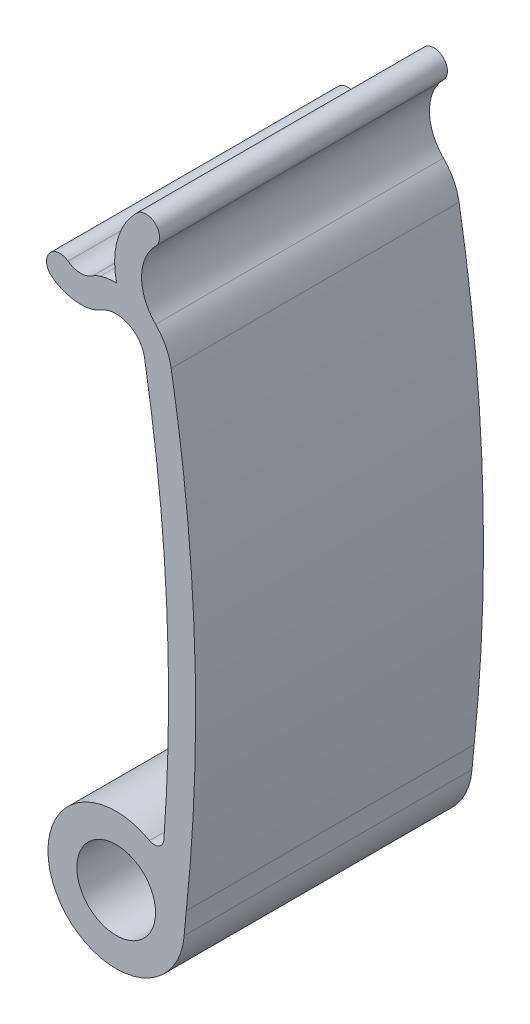
ISO-10303-21;
HEADER;
FILE_DESCRIPTION(('STEP AP214'),'2;1');
FILE_NAME('part.step','',(''),(''),'','','');
FILE_SCHEMA(('AUTOMOTIVE_DESIGN { 1 0 10303 214 1 1 1 1 }'));
ENDSEC;
DATA;
#1=APPLICATION_CONTEXT('core data for automotive mechanical design processes');
#2=APPLICATION_PROTOCOL_DEFINITION('international standard','automotive_design',2000,#1);
#3=PRODUCT_CONTEXT('',#1,'mechanical');
#4=PRODUCT('Part','Part','',(#3));
#5=PRODUCT_RELATED_PRODUCT_CATEGORY('part','',(#4));
#6=PRODUCT_DEFINITION_FORMATION('','',#4);
#7=PRODUCT_DEFINITION_CONTEXT('part definition',#1,'design');
#8=PRODUCT_DEFINITION('design','',#6,#7);
#9=PRODUCT_DEFINITION_SHAPE('','',#8);
#10=(LENGTH_UNIT() NAMED_UNIT(*) SI_UNIT(.MILLI.,.METRE.));
#11=(NAMED_UNIT(*) PLANE_ANGLE_UNIT() SI_UNIT($,.RADIAN.));
#12=(NAMED_UNIT(*) SI_UNIT($,.STERADIAN.) SOLID_ANGLE_UNIT());
#13=UNCERTAINTY_MEASURE_WITH_UNIT(LENGTH_MEASURE(1.E-05),#10,'distance_accuracy_value','');
#14=(GEOMETRIC_REPRESENTATION_CONTEXT(3) GLOBAL_UNCERTAINTY_ASSIGNED_CONTEXT((#13)) GLOBAL_UNIT_ASSIGNED_CONTEXT((#10,
#11,#12)) REPRESENTATION_CONTEXT('',''));
#15=CARTESIAN_POINT('',(0.,0.,0.));
#16=DIRECTION('',(0.,0.,1.));
#17=DIRECTION('',(1.,0.,0.));
#18=AXIS2_PLACEMENT_3D('',#15,#16,#17);
#19=CARTESIAN_POINT('',(3.81837661840536,52.8183766183916,30.));
#20=DIRECTION('',(0.,0.,1.));
#21=DIRECTION('',(1.,0.,0.));
#22=AXIS2_PLACEMENT_3D('',#19,#20,#21);
#23=PLANE('',#22);
#24=CARTESIAN_POINT('',(7.63675323681256,56.6367532368027,30.));
#25=DIRECTION('',(0.,0.,-1.));
#26=DIRECTION('',(1.,0.,0.));
#27=AXIS2_PLACEMENT_3D('',#24,#25,#26);
#28=CIRCLE('',#27,4.98999999999288);
#29=CARTESIAN_POINT('',(4.10829039870005,53.1082903986866,30.));
#30=VERTEX_POINT('',#29);
#31=CARTESIAN_POINT('',(4.10829039870365,60.1652160749285,30.));
#32=VERTEX_POINT('',#31);
#33=EDGE_CURVE('E236',#30,#32,#28,.T.);
#34=ORIENTED_EDGE('',*,*,#33,.T.);
#35=CARTESIAN_POINT('',(3.11480537113575,61.1587011024965,30.));
#36=DIRECTION('',(0.,0.,1.));
#37=DIRECTION('',(1.,0.,0.));
#38=AXIS2_PLACEMENT_3D('',#35,#36,#37);
#39=CIRCLE('',#38,1.40500000000114);
#40=CARTESIAN_POINT('',(2.12132034356786,62.1521861300644,30.));
#41=VERTEX_POINT('',#40);
#42=EDGE_CURVE('E124',#32,#41,#39,.T.);
#43=ORIENTED_EDGE('',*,*,#42,.T.);
#44=CARTESIAN_POINT('',(7.63675323681256,56.6367532368027,30.));
#45=DIRECTION('',(0.,0.,1.));
#46=DIRECTION('',(1.,0.,0.));
#47=AXIS2_PLACEMENT_3D('',#44,#45,#46);
#48=CIRCLE('',#47,7.79999999999547);
#49=CARTESIAN_POINT('',(0.0537416684139435,54.8097514433,30.));
#50=VERTEX_POINT('',#49);
#51=EDGE_CURVE('E289',#41,#50,#48,.T.);
#52=ORIENTED_EDGE('',*,*,#51,.T.);
#53=CARTESIAN_POINT('',(-1.83371113432473E-12,48.9999999999805,30.));
#54=DIRECTION('',(0.,0.,1.));
#55=DIRECTION('',(1.,0.,0.));
#56=AXIS2_PLACEMENT_3D('',#53,#54,#55);
#57=CIRCLE('',#56,5.81000000000713);
#58=CARTESIAN_POINT('',(-1.64437253854609,54.5724446120484,30.));
#59=VERTEX_POINT('',#58);
#60=EDGE_CURVE('E309',#50,#59,#57,.T.);
#61=ORIENTED_EDGE('',*,*,#60,.T.);
#62=CARTESIAN_POINT('',(-0.795298938635227,51.6951066023709,30.));
#63=DIRECTION('',(0.,0.,1.));
#64=DIRECTION('',(-1.,0.,0.));
#65=AXIS2_PLACEMENT_3D('',#62,#63,#64);
#66=CIRCLE('',#65,2.99999999999999);
#67=CARTESIAN_POINT('',(-2.47100072873564,54.1834842888676,30.));
#68=VERTEX_POINT('',#67);
#69=EDGE_CURVE('E305',#59,#68,#66,.T.);
#70=ORIENTED_EDGE('',*,*,#69,.T.);
#71=CARTESIAN_POINT('',(-3.69426303552788,55.9999999999973,30.));
#72=DIRECTION('',(0.,0.,-1.));
#73=DIRECTION('',(1.,0.,0.));
#74=AXIS2_PLACEMENT_3D('',#71,#72,#73);
#75=CIRCLE('',#74,2.19);
#76=CARTESIAN_POINT('',(-5.00826303552788,54.2479999999973,30.));
#77=VERTEX_POINT('',#76);
#78=EDGE_CURVE('E308',#68,#77,#75,.T.);
#79=ORIENTED_EDGE('',*,*,#78,.T.);
#80=CARTESIAN_POINT('',(-5.85126303552771,53.1239999999976,30.));
#81=DIRECTION('',(0.,0.,1.));
#82=DIRECTION('',(1.,0.,0.));
#83=AXIS2_PLACEMENT_3D('',#80,#81,#82);
#84=CIRCLE('',#83,1.40499999999971);
#85=CARTESIAN_POINT('',(-6.69426303552754,51.9999999999978,30.));
#86=VERTEX_POINT('',#85);
#87=EDGE_CURVE('E313',#77,#86,#84,.T.);
#88=ORIENTED_EDGE('',*,*,#87,.T.);
#89=CARTESIAN_POINT('',(-3.69426303552788,55.9999999999973,30.));
#90=DIRECTION('',(0.,0.,1.));
#91=DIRECTION('',(1.,0.,0.));
#92=AXIS2_PLACEMENT_3D('',#89,#90,#91);
#93=CIRCLE('',#92,4.99999999999943);
#94=CARTESIAN_POINT('',(-3.21182535477371,51.023329035971,30.));
#95=VERTEX_POINT('',#94);
#96=EDGE_CURVE('E320',#86,#95,#93,.T.);
#97=ORIENTED_EDGE('',*,*,#96,.T.);
#98=CARTESIAN_POINT('',(-3.59777549934888,55.0046658071953,30.));
#99=DIRECTION('',(0.,0.,1.));
#100=DIRECTION('',(1.,0.,0.));
#101=AXIS2_PLACEMENT_3D('',#98,#99,#100);
#102=CIRCLE('',#101,4.);
#103=CARTESIAN_POINT('',(-1.54190378544653,51.5734282030681,30.));
#104=VERTEX_POINT('',#103);
#105=EDGE_CURVE('E323',#95,#104,#102,.T.);
#106=ORIENTED_EDGE('',*,*,#105,.T.);
#107=CARTESIAN_POINT('',(-1.83371113432473E-12,48.9999999999805,30.));
#108=DIRECTION('',(0.,0.,-1.));
#109=DIRECTION('',(1.,0.,0.));
#110=AXIS2_PLACEMENT_3D('',#107,#108,#109);
#111=CIRCLE('',#110,3.0000000000004);
#112=CARTESIAN_POINT('',(2.9634476844801,49.4668809498393,30.));
#113=VERTEX_POINT('',#112);
#114=EDGE_CURVE('E326',#104,#113,#111,.T.);
#115=ORIENTED_EDGE('',*,*,#114,.T.);
#116=CARTESIAN_POINT('',(-168.827300894525,20.0737468694761,30.));
#117=DIRECTION('',(0.,0.,-1.));
#118=DIRECTION('',(1.,0.,0.));
#119=AXIS2_PLACEMENT_3D('',#116,#117,#118);
#120=CIRCLE('',#119,174.28717000514);
#121=CARTESIAN_POINT('',(4.9685329803078,6.99606526485237,30.));
#122=VERTEX_POINT('',#121);
#123=EDGE_CURVE('E329',#113,#122,#120,.T.);
#124=ORIENTED_EDGE('',*,*,#123,.T.);
#125=CARTESIAN_POINT('',(3.97135209849246,7.07110051618069,30.));
#126=DIRECTION('',(0.,0.,-1.));
#127=DIRECTION('',(1.,0.,0.));
#128=AXIS2_PLACEMENT_3D('',#125,#126,#127);
#129=CIRCLE('',#128,0.999999999998197);
#130=CARTESIAN_POINT('',(3.48166626637826,6.19920156227433,30.));
#131=VERTEX_POINT('',#130);
#132=EDGE_CURVE('E332',#122,#131,#129,.T.);
#133=ORIENTED_EDGE('',*,*,#132,.T.);
#134=CARTESIAN_POINT('',(-1.13619508766705E-11,-2.87762164357525E-12,30.));
#135=DIRECTION('',(0.,0.,1.));
#136=DIRECTION('',(1.,0.,0.));
#137=AXIS2_PLACEMENT_3D('',#134,#135,#136);
#138=CIRCLE('',#137,7.11000000001977);
#139=CARTESIAN_POINT('',(7.08641136872805,-0.578682912556882,30.));
#140=VERTEX_POINT('',#139);
#141=EDGE_CURVE('E167',#131,#140,#138,.T.);
#142=ORIENTED_EDGE('',*,*,#141,.T.);
#143=CARTESIAN_POINT('',(106.754644402773,-8.71768308897163,30.));
#144=DIRECTION('',(0.,0.,-1.));
#145=DIRECTION('',(-1.,0.,0.));
#146=AXIS2_PLACEMENT_3D('',#143,#144,#145);
#147=CIRCLE('',#146,100.000000000004);
#148=CARTESIAN_POINT('',(7.30747963802911,1.78286071859413,30.));
#149=VERTEX_POINT('',#148);
#150=EDGE_CURVE('E161',#140,#149,#147,.T.);
#151=ORIENTED_EDGE('',*,*,#150,.T.);
#152=CARTESIAN_POINT('',(-167.014909156982,20.1894174519368,30.));
#153=DIRECTION('',(0.,0.,1.));
#154=DIRECTION('',(1.,0.,0.));
#155=AXIS2_PLACEMENT_3D('',#152,#153,#154);
#156=CIRCLE('',#155,175.291461760055);
#157=CARTESIAN_POINT('',(5.73332285303255,49.9408023506448,30.));
#158=VERTEX_POINT('',#157);
#159=EDGE_CURVE('E165',#149,#158,#156,.T.);
#160=ORIENTED_EDGE('',*,*,#159,.T.);
#161=CARTESIAN_POINT('',(-1.83371113432473E-12,48.9999999999805,30.));
#162=DIRECTION('',(0.,0.,1.));
#163=DIRECTION('',(1.,0.,0.));
#164=AXIS2_PLACEMENT_3D('',#161,#162,#163);
#165=CIRCLE('',#164,5.81000000001437);
#166=EDGE_CURVE('E57',#158,#30,#165,.T.);
#167=ORIENTED_EDGE('',*,*,#166,.T.);
#168=EDGE_LOOP('',(#34,#43,#52,#61,#70,#79,#88,#97,#106,#115,#124,#133,#142,#151,#160,#167));
#169=FACE_BOUND('',#168,.T.);
#170=CARTESIAN_POINT('',(-1.13619508766705E-11,-2.87762164357525E-12,30.));
#171=DIRECTION('',(0.,0.,1.));
#172=DIRECTION('',(1.,0.,0.));
#173=AXIS2_PLACEMENT_3D('',#170,#171,#172);
#174=CIRCLE('',#173,4.1);
#175=CARTESIAN_POINT('',(4.09999999998864,-2.87762164357525E-12,30.));
#176=VERTEX_POINT('',#175);
#177=EDGE_CURVE('E194',#176,#176,#174,.T.);
#178=ORIENTED_EDGE('',*,*,#177,.F.);
#179=EDGE_LOOP('',(#178));
#180=FACE_BOUND('',#179,.T.);
#181=ADVANCED_FACE('F39',(#169,#180),#23,.T.);
#182=CARTESIAN_POINT('',(3.81837661840536,52.8183766183916,0.));
#183=DIRECTION('',(0.,0.,1.));
#184=DIRECTION('',(1.,0.,0.));
#185=AXIS2_PLACEMENT_3D('',#182,#183,#184);
#186=PLANE('',#185);
#187=CARTESIAN_POINT('',(7.63675323681256,56.6367532368027,0.));
#188=DIRECTION('',(0.,0.,-1.));
#189=DIRECTION('',(1.,0.,0.));
#190=AXIS2_PLACEMENT_3D('',#187,#188,#189);
#191=CIRCLE('',#190,4.98999999999288);
#192=CARTESIAN_POINT('',(4.10829039870005,53.1082903986866,0.));
#193=VERTEX_POINT('',#192);
#194=CARTESIAN_POINT('',(4.10829039870365,60.1652160749285,0.));
#195=VERTEX_POINT('',#194);
#196=EDGE_CURVE('E189',#193,#195,#191,.T.);
#197=ORIENTED_EDGE('',*,*,#196,.F.);
#198=CARTESIAN_POINT('',(-1.83371113432473E-12,48.9999999999805,0.));
#199=DIRECTION('',(0.,0.,1.));
#200=DIRECTION('',(1.,0.,0.));
#201=AXIS2_PLACEMENT_3D('',#198,#199,#200);
#202=CIRCLE('',#201,5.81000000001437);
#203=CARTESIAN_POINT('',(5.73332285303255,49.9408023506448,0.));
#204=VERTEX_POINT('',#203);
#205=EDGE_CURVE('E116',#204,#193,#202,.T.);
#206=ORIENTED_EDGE('',*,*,#205,.F.);
#207=CARTESIAN_POINT('',(-167.014909156982,20.1894174519368,0.));
#208=DIRECTION('',(0.,0.,1.));
#209=DIRECTION('',(1.,0.,0.));
#210=AXIS2_PLACEMENT_3D('',#207,#208,#209);
#211=CIRCLE('',#210,175.291461760055);
#212=CARTESIAN_POINT('',(7.30747963802911,1.78286071859413,0.));
#213=VERTEX_POINT('',#212);
#214=EDGE_CURVE('E110',#213,#204,#211,.T.);
#215=ORIENTED_EDGE('',*,*,#214,.F.);
#216=CARTESIAN_POINT('',(106.754644402773,-8.71768308897163,0.));
#217=DIRECTION('',(0.,0.,-1.));
#218=DIRECTION('',(-1.,0.,0.));
#219=AXIS2_PLACEMENT_3D('',#216,#217,#218);
#220=CIRCLE('',#219,100.000000000004);
#221=CARTESIAN_POINT('',(7.08641136872805,-0.578682912556882,0.));
#222=VERTEX_POINT('',#221);
#223=EDGE_CURVE('E176',#222,#213,#220,.T.);
#224=ORIENTED_EDGE('',*,*,#223,.F.);
#225=CARTESIAN_POINT('',(-1.13619508766705E-11,-2.87762164357525E-12,0.));
#226=DIRECTION('',(0.,0.,1.));
#227=DIRECTION('',(1.,0.,0.));
#228=AXIS2_PLACEMENT_3D('',#225,#226,#227);
#229=CIRCLE('',#228,7.11000000001977);
#230=CARTESIAN_POINT('',(3.48166626637826,6.19920156227433,0.));
#231=VERTEX_POINT('',#230);
#232=EDGE_CURVE('E227',#231,#222,#229,.T.);
#233=ORIENTED_EDGE('',*,*,#232,.F.);
#234=CARTESIAN_POINT('',(3.97135209849246,7.07110051618069,0.));
#235=DIRECTION('',(0.,0.,-1.));
#236=DIRECTION('',(1.,0.,0.));
#237=AXIS2_PLACEMENT_3D('',#234,#235,#236);
#238=CIRCLE('',#237,0.999999999998197);
#239=CARTESIAN_POINT('',(4.9685329803078,6.99606526485237,0.));
#240=VERTEX_POINT('',#239);
#241=EDGE_CURVE('E224',#240,#231,#238,.T.);
#242=ORIENTED_EDGE('',*,*,#241,.F.);
#243=CARTESIAN_POINT('',(-168.827300894525,20.0737468694761,0.));
#244=DIRECTION('',(0.,0.,-1.));
#245=DIRECTION('',(1.,0.,0.));
#246=AXIS2_PLACEMENT_3D('',#243,#244,#245);
#247=CIRCLE('',#246,174.28717000514);
#248=CARTESIAN_POINT('',(2.9634476844801,49.4668809498393,0.));
#249=VERTEX_POINT('',#248);
#250=EDGE_CURVE('E221',#249,#240,#247,.T.);
#251=ORIENTED_EDGE('',*,*,#250,.F.);
#252=CARTESIAN_POINT('',(-1.83371113432473E-12,48.9999999999805,0.));
#253=DIRECTION('',(0.,0.,-1.));
#254=DIRECTION('',(1.,0.,0.));
#255=AXIS2_PLACEMENT_3D('',#252,#253,#254);
#256=CIRCLE('',#255,3.0000000000004);
#257=CARTESIAN_POINT('',(-1.54190378544653,51.5734282030681,0.));
#258=VERTEX_POINT('',#257);
#259=EDGE_CURVE('E218',#258,#249,#256,.T.);
#260=ORIENTED_EDGE('',*,*,#259,.F.);
#261=CARTESIAN_POINT('',(-3.59777549934888,55.0046658071953,0.));
#262=DIRECTION('',(0.,0.,1.));
#263=DIRECTION('',(1.,0.,0.));
#264=AXIS2_PLACEMENT_3D('',#261,#262,#263);
#265=CIRCLE('',#264,4.);
#266=CARTESIAN_POINT('',(-3.21182535477371,51.023329035971,0.));
#267=VERTEX_POINT('',#266);
#268=EDGE_CURVE('E215',#267,#258,#265,.T.);
#269=ORIENTED_EDGE('',*,*,#268,.F.);
#270=CARTESIAN_POINT('',(-3.69426303552788,55.9999999999973,0.));
#271=DIRECTION('',(0.,0.,1.));
#272=DIRECTION('',(1.,0.,0.));
#273=AXIS2_PLACEMENT_3D('',#270,#271,#272);
#274=CIRCLE('',#273,4.99999999999943);
#275=CARTESIAN_POINT('',(-6.69426303552754,51.9999999999978,0.));
#276=VERTEX_POINT('',#275);
#277=EDGE_CURVE('E212',#276,#267,#274,.T.);
#278=ORIENTED_EDGE('',*,*,#277,.F.);
#279=CARTESIAN_POINT('',(-5.85126303552771,53.1239999999976,0.));
#280=DIRECTION('',(0.,0.,1.));
#281=DIRECTION('',(1.,0.,0.));
#282=AXIS2_PLACEMENT_3D('',#279,#280,#281);
#283=CIRCLE('',#282,1.40499999999971);
#284=CARTESIAN_POINT('',(-5.00826303552788,54.2479999999973,0.));
#285=VERTEX_POINT('',#284);
#286=EDGE_CURVE('E209',#285,#276,#283,.T.);
#287=ORIENTED_EDGE('',*,*,#286,.F.);
#288=CARTESIAN_POINT('',(-3.69426303552788,55.9999999999973,0.));
#289=DIRECTION('',(0.,0.,-1.));
#290=DIRECTION('',(1.,0.,0.));
#291=AXIS2_PLACEMENT_3D('',#288,#289,#290);
#292=CIRCLE('',#291,2.19);
#293=CARTESIAN_POINT('',(-2.47100072873564,54.1834842888676,0.));
#294=VERTEX_POINT('',#293);
#295=EDGE_CURVE('E206',#294,#285,#292,.T.);
#296=ORIENTED_EDGE('',*,*,#295,.F.);
#297=CARTESIAN_POINT('',(-0.795298938635227,51.6951066023709,0.));
#298=DIRECTION('',(0.,0.,1.));
#299=DIRECTION('',(-1.,0.,0.));
#300=AXIS2_PLACEMENT_3D('',#297,#298,#299);
#301=CIRCLE('',#300,2.99999999999999);
#302=CARTESIAN_POINT('',(-1.64437253854609,54.5724446120484,0.));
#303=VERTEX_POINT('',#302);
#304=EDGE_CURVE('E203',#303,#294,#301,.T.);
#305=ORIENTED_EDGE('',*,*,#304,.F.);
#306=CARTESIAN_POINT('',(-1.83371113432473E-12,48.9999999999805,0.));
#307=DIRECTION('',(0.,0.,1.));
#308=DIRECTION('',(1.,0.,0.));
#309=AXIS2_PLACEMENT_3D('',#306,#307,#308);
#310=CIRCLE('',#309,5.81000000000713);
#311=CARTESIAN_POINT('',(0.0537416684139435,54.8097514433,0.));
#312=VERTEX_POINT('',#311);
#313=EDGE_CURVE('E200',#312,#303,#310,.T.);
#314=ORIENTED_EDGE('',*,*,#313,.F.);
#315=CARTESIAN_POINT('',(7.63675323681256,56.6367532368027,0.));
#316=DIRECTION('',(0.,0.,1.));
#317=DIRECTION('',(1.,0.,0.));
#318=AXIS2_PLACEMENT_3D('',#315,#316,#317);
#319=CIRCLE('',#318,7.79999999999547);
#320=CARTESIAN_POINT('',(2.12132034356786,62.1521861300644,0.));
#321=VERTEX_POINT('',#320);
#322=EDGE_CURVE('E197',#321,#312,#319,.T.);
#323=ORIENTED_EDGE('',*,*,#322,.F.);
#324=CARTESIAN_POINT('',(3.11480537113575,61.1587011024965,0.));
#325=DIRECTION('',(0.,0.,1.));
#326=DIRECTION('',(1.,0.,0.));
#327=AXIS2_PLACEMENT_3D('',#324,#325,#326);
#328=CIRCLE('',#327,1.40500000000114);
#329=EDGE_CURVE('E193',#195,#321,#328,.T.);
#330=ORIENTED_EDGE('',*,*,#329,.F.);
#331=EDGE_LOOP('',(#197,#206,#215,#224,#233,#242,#251,#260,#269,#278,#287,#296,#305,#314,#323,#330));
#332=FACE_BOUND('',#331,.T.);
#333=CARTESIAN_POINT('',(-1.13619508766705E-11,-2.87762164357525E-12,0.));
#334=DIRECTION('',(0.,0.,1.));
#335=DIRECTION('',(1.,0.,0.));
#336=AXIS2_PLACEMENT_3D('',#333,#334,#335);
#337=CIRCLE('',#336,4.1);
#338=CARTESIAN_POINT('',(4.09999999998864,-2.87762164357525E-12,0.));
#339=VERTEX_POINT('',#338);
#340=EDGE_CURVE('E533',#339,#339,#337,.T.);
#341=ORIENTED_EDGE('',*,*,#340,.T.);
#342=EDGE_LOOP('',(#341));
#343=FACE_BOUND('',#342,.T.);
#344=ADVANCED_FACE('F293',(#332,#343),#186,.F.);
#345=CARTESIAN_POINT('',(7.63675323681256,56.6367532368027,30.));
#346=DIRECTION('',(0.,0.,-1.));
#347=DIRECTION('',(-1.,0.,0.));
#348=AXIS2_PLACEMENT_3D('',#345,#346,#347);
#349=CYLINDRICAL_SURFACE('',#348,4.98999999999288);
#350=ORIENTED_EDGE('',*,*,#196,.T.);
#351=DIRECTION('',(0.,0.,-1.));
#352=VECTOR('',#351,1.);
#353=CARTESIAN_POINT('',(4.10829039870365,60.1652160749285,30.));
#354=LINE('',#353,#352);
#355=EDGE_CURVE('E11',#32,#195,#354,.T.);
#356=ORIENTED_EDGE('',*,*,#355,.F.);
#357=ORIENTED_EDGE('',*,*,#33,.F.);
#358=DIRECTION('',(0.,0.,-1.));
#359=VECTOR('',#358,1.);
#360=CARTESIAN_POINT('',(4.10829039870005,53.1082903986866,30.));
#361=LINE('',#360,#359);
#362=EDGE_CURVE('E185',#30,#193,#361,.T.);
#363=ORIENTED_EDGE('',*,*,#362,.T.);
#364=EDGE_LOOP('',(#350,#356,#357,#363));
#365=FACE_BOUND('',#364,.T.);
#366=ADVANCED_FACE('F41',(#365),#349,.F.);
#367=CARTESIAN_POINT('',(3.11480537113575,61.1587011024965,30.));
#368=DIRECTION('',(0.,0.,-1.));
#369=DIRECTION('',(-1.,0.,0.));
#370=AXIS2_PLACEMENT_3D('',#367,#368,#369);
#371=CYLINDRICAL_SURFACE('',#370,1.40500000000114);
#372=ORIENTED_EDGE('',*,*,#329,.T.);
#373=DIRECTION('',(0.,0.,-1.));
#374=VECTOR('',#373,1.);
#375=CARTESIAN_POINT('',(2.12132034356786,62.1521861300644,30.));
#376=LINE('',#375,#374);
#377=EDGE_CURVE('E49',#41,#321,#376,.T.);
#378=ORIENTED_EDGE('',*,*,#377,.F.);
#379=ORIENTED_EDGE('',*,*,#42,.F.);
#380=ORIENTED_EDGE('',*,*,#355,.T.);
#381=EDGE_LOOP('',(#372,#378,#379,#380));
#382=FACE_BOUND('',#381,.T.);
#383=ADVANCED_FACE('F368',(#382),#371,.T.);
#384=CARTESIAN_POINT('',(7.63675323681256,56.6367532368027,30.));
#385=DIRECTION('',(0.,0.,-1.));
#386=DIRECTION('',(-1.,0.,0.));
#387=AXIS2_PLACEMENT_3D('',#384,#385,#386);
#388=CYLINDRICAL_SURFACE('',#387,7.79999999999547);
#389=ORIENTED_EDGE('',*,*,#322,.T.);
#390=DIRECTION('',(0.,0.,-1.));
#391=VECTOR('',#390,1.);
#392=CARTESIAN_POINT('',(0.0537416684139435,54.8097514433,30.));
#393=LINE('',#392,#391);
#394=EDGE_CURVE('E279',#50,#312,#393,.T.);
#395=ORIENTED_EDGE('',*,*,#394,.F.);
#396=ORIENTED_EDGE('',*,*,#51,.F.);
#397=ORIENTED_EDGE('',*,*,#377,.T.);
#398=EDGE_LOOP('',(#389,#395,#396,#397));
#399=FACE_BOUND('',#398,.T.);
#400=ADVANCED_FACE('F287',(#399),#388,.T.);
#401=CARTESIAN_POINT('',(-1.83371113432473E-12,48.9999999999805,30.));
#402=DIRECTION('',(0.,0.,-1.));
#403=DIRECTION('',(-1.,0.,0.));
#404=AXIS2_PLACEMENT_3D('',#401,#402,#403);
#405=CYLINDRICAL_SURFACE('',#404,5.81000000000713);
#406=ORIENTED_EDGE('',*,*,#313,.T.);
#407=DIRECTION('',(0.,0.,-1.));
#408=VECTOR('',#407,1.);
#409=CARTESIAN_POINT('',(-1.64437253854609,54.5724446120484,30.));
#410=LINE('',#409,#408);
#411=EDGE_CURVE('E275',#59,#303,#410,.T.);
#412=ORIENTED_EDGE('',*,*,#411,.F.);
#413=ORIENTED_EDGE('',*,*,#60,.F.);
#414=ORIENTED_EDGE('',*,*,#394,.T.);
#415=EDGE_LOOP('',(#406,#412,#413,#414));
#416=FACE_BOUND('',#415,.T.);
#417=ADVANCED_FACE('F299',(#416),#405,.T.);
#418=CARTESIAN_POINT('',(-0.795298938635227,51.6951066023709,30.));
#419=DIRECTION('',(0.,0.,-1.));
#420=DIRECTION('',(-1.,0.,0.));
#421=AXIS2_PLACEMENT_3D('',#418,#419,#420);
#422=CYLINDRICAL_SURFACE('',#421,2.99999999999999);
#423=ORIENTED_EDGE('',*,*,#304,.T.);
#424=DIRECTION('',(0.,0.,-1.));
#425=VECTOR('',#424,1.);
#426=CARTESIAN_POINT('',(-2.47100072873564,54.1834842888676,30.));
#427=LINE('',#426,#425);
#428=EDGE_CURVE('E271',#68,#294,#427,.T.);
#429=ORIENTED_EDGE('',*,*,#428,.F.);
#430=ORIENTED_EDGE('',*,*,#69,.F.);
#431=ORIENTED_EDGE('',*,*,#411,.T.);
#432=EDGE_LOOP('',(#423,#429,#430,#431));
#433=FACE_BOUND('',#432,.T.);
#434=ADVANCED_FACE('F303',(#433),#422,.T.);
#435=CARTESIAN_POINT('',(-3.69426303552788,55.9999999999973,30.));
#436=DIRECTION('',(0.,0.,-1.));
#437=DIRECTION('',(-1.,0.,0.));
#438=AXIS2_PLACEMENT_3D('',#435,#436,#437);
#439=CYLINDRICAL_SURFACE('',#438,2.19);
#440=ORIENTED_EDGE('',*,*,#295,.T.);
#441=DIRECTION('',(0.,0.,-1.));
#442=VECTOR('',#441,1.);
#443=CARTESIAN_POINT('',(-5.00826303552788,54.2479999999973,30.));
#444=LINE('',#443,#442);
#445=EDGE_CURVE('E267',#77,#285,#444,.T.);
#446=ORIENTED_EDGE('',*,*,#445,.F.);
#447=ORIENTED_EDGE('',*,*,#78,.F.);
#448=ORIENTED_EDGE('',*,*,#428,.T.);
#449=EDGE_LOOP('',(#440,#446,#447,#448));
#450=FACE_BOUND('',#449,.T.);
#451=ADVANCED_FACE('F381',(#450),#439,.F.);
#452=CARTESIAN_POINT('',(-5.85126303552771,53.1239999999976,30.));
#453=DIRECTION('',(0.,0.,-1.));
#454=DIRECTION('',(-1.,0.,0.));
#455=AXIS2_PLACEMENT_3D('',#452,#453,#454);
#456=CYLINDRICAL_SURFACE('',#455,1.40499999999971);
#457=ORIENTED_EDGE('',*,*,#286,.T.);
#458=DIRECTION('',(0.,0.,-1.));
#459=VECTOR('',#458,1.);
#460=CARTESIAN_POINT('',(-6.69426303552754,51.9999999999978,30.));
#461=LINE('',#460,#459);
#462=EDGE_CURVE('E263',#86,#276,#461,.T.);
#463=ORIENTED_EDGE('',*,*,#462,.F.);
#464=ORIENTED_EDGE('',*,*,#87,.F.);
#465=ORIENTED_EDGE('',*,*,#445,.T.);
#466=EDGE_LOOP('',(#457,#463,#464,#465));
#467=FACE_BOUND('',#466,.T.);
#468=ADVANCED_FACE('F384',(#467),#456,.T.);
#469=CARTESIAN_POINT('',(-3.69426303552788,55.9999999999973,30.));
#470=DIRECTION('',(0.,0.,-1.));
#471=DIRECTION('',(-1.,0.,0.));
#472=AXIS2_PLACEMENT_3D('',#469,#470,#471);
#473=CYLINDRICAL_SURFACE('',#472,4.99999999999943);
#474=ORIENTED_EDGE('',*,*,#277,.T.);
#475=DIRECTION('',(0.,0.,-1.));
#476=VECTOR('',#475,1.);
#477=CARTESIAN_POINT('',(-3.21182535477371,51.023329035971,30.));
#478=LINE('',#477,#476);
#479=EDGE_CURVE('E259',#95,#267,#478,.T.);
#480=ORIENTED_EDGE('',*,*,#479,.F.);
#481=ORIENTED_EDGE('',*,*,#96,.F.);
#482=ORIENTED_EDGE('',*,*,#462,.T.);
#483=EDGE_LOOP('',(#474,#480,#481,#482));
#484=FACE_BOUND('',#483,.T.);
#485=ADVANCED_FACE('F388',(#484),#473,.T.);
#486=CARTESIAN_POINT('',(-3.59777549934888,55.0046658071953,30.));
#487=DIRECTION('',(0.,0.,-1.));
#488=DIRECTION('',(-1.,0.,0.));
#489=AXIS2_PLACEMENT_3D('',#486,#487,#488);
#490=CYLINDRICAL_SURFACE('',#489,4.);
#491=ORIENTED_EDGE('',*,*,#268,.T.);
#492=DIRECTION('',(0.,0.,-1.));
#493=VECTOR('',#492,1.);
#494=CARTESIAN_POINT('',(-1.54190378544653,51.5734282030681,30.));
#495=LINE('',#494,#493);
#496=EDGE_CURVE('E255',#104,#258,#495,.T.);
#497=ORIENTED_EDGE('',*,*,#496,.F.);
#498=ORIENTED_EDGE('',*,*,#105,.F.);
#499=ORIENTED_EDGE('',*,*,#479,.T.);
#500=EDGE_LOOP('',(#491,#497,#498,#499));
#501=FACE_BOUND('',#500,.T.);
#502=ADVANCED_FACE('F392',(#501),#490,.T.);
#503=CARTESIAN_POINT('',(-1.83371113432473E-12,48.9999999999805,30.));
#504=DIRECTION('',(0.,0.,-1.));
#505=DIRECTION('',(-1.,0.,0.));
#506=AXIS2_PLACEMENT_3D('',#503,#504,#505);
#507=CYLINDRICAL_SURFACE('',#506,3.0000000000004);
#508=ORIENTED_EDGE('',*,*,#259,.T.);
#509=DIRECTION('',(0.,0.,-1.));
#510=VECTOR('',#509,1.);
#511=CARTESIAN_POINT('',(2.9634476844801,49.4668809498393,30.));
#512=LINE('',#511,#510);
#513=EDGE_CURVE('E251',#113,#249,#512,.T.);
#514=ORIENTED_EDGE('',*,*,#513,.F.);
#515=ORIENTED_EDGE('',*,*,#114,.F.);
#516=ORIENTED_EDGE('',*,*,#496,.T.);
#517=EDGE_LOOP('',(#508,#514,#515,#516));
#518=FACE_BOUND('',#517,.T.);
#519=ADVANCED_FACE('F396',(#518),#507,.F.);
#520=CARTESIAN_POINT('',(-168.827300894525,20.0737468694761,30.));
#521=DIRECTION('',(0.,0.,-1.));
#522=DIRECTION('',(-1.,0.,0.));
#523=AXIS2_PLACEMENT_3D('',#520,#521,#522);
#524=CYLINDRICAL_SURFACE('',#523,174.28717000514);
#525=ORIENTED_EDGE('',*,*,#250,.T.);
#526=DIRECTION('',(0.,0.,-1.));
#527=VECTOR('',#526,1.);
#528=CARTESIAN_POINT('',(4.9685329803078,6.99606526485237,30.));
#529=LINE('',#528,#527);
#530=EDGE_CURVE('E247',#122,#240,#529,.T.);
#531=ORIENTED_EDGE('',*,*,#530,.F.);
#532=ORIENTED_EDGE('',*,*,#123,.F.);
#533=ORIENTED_EDGE('',*,*,#513,.T.);
#534=EDGE_LOOP('',(#525,#531,#532,#533));
#535=FACE_BOUND('',#534,.T.);
#536=ADVANCED_FACE('F400',(#535),#524,.F.);
#537=CARTESIAN_POINT('',(3.97135209849246,7.07110051618069,30.));
#538=DIRECTION('',(0.,0.,-1.));
#539=DIRECTION('',(-1.,0.,0.));
#540=AXIS2_PLACEMENT_3D('',#537,#538,#539);
#541=CYLINDRICAL_SURFACE('',#540,0.999999999998197);
#542=ORIENTED_EDGE('',*,*,#241,.T.);
#543=DIRECTION('',(0.,0.,-1.));
#544=VECTOR('',#543,1.);
#545=CARTESIAN_POINT('',(3.48166626637826,6.19920156227433,30.));
#546=LINE('',#545,#544);
#547=EDGE_CURVE('E243',#131,#231,#546,.T.);
#548=ORIENTED_EDGE('',*,*,#547,.F.);
#549=ORIENTED_EDGE('',*,*,#132,.F.);
#550=ORIENTED_EDGE('',*,*,#530,.T.);
#551=EDGE_LOOP('',(#542,#548,#549,#550));
#552=FACE_BOUND('',#551,.T.);
#553=ADVANCED_FACE('F340',(#552),#541,.F.);
#554=CARTESIAN_POINT('',(-1.13619508766705E-11,-2.87762164357525E-12,30.));
#555=DIRECTION('',(0.,0.,-1.));
#556=DIRECTION('',(-1.,0.,0.));
#557=AXIS2_PLACEMENT_3D('',#554,#555,#556);
#558=CYLINDRICAL_SURFACE('',#557,7.11000000001977);
#559=ORIENTED_EDGE('',*,*,#232,.T.);
#560=DIRECTION('',(0.,0.,-1.));
#561=VECTOR('',#560,1.);
#562=CARTESIAN_POINT('',(7.08641136872805,-0.578682912556882,30.));
#563=LINE('',#562,#561);
#564=EDGE_CURVE('E178',#140,#222,#563,.T.);
#565=ORIENTED_EDGE('',*,*,#564,.F.);
#566=ORIENTED_EDGE('',*,*,#141,.F.);
#567=ORIENTED_EDGE('',*,*,#547,.T.);
#568=EDGE_LOOP('',(#559,#565,#566,#567));
#569=FACE_BOUND('',#568,.T.);
#570=ADVANCED_FACE('F344',(#569),#558,.T.);
#571=CARTESIAN_POINT('',(106.754644402773,-8.71768308897163,30.));
#572=DIRECTION('',(0.,0.,-1.));
#573=DIRECTION('',(-1.,0.,0.));
#574=AXIS2_PLACEMENT_3D('',#571,#572,#573);
#575=CYLINDRICAL_SURFACE('',#574,100.000000000004);
#576=ORIENTED_EDGE('',*,*,#223,.T.);
#577=DIRECTION('',(0.,0.,-1.));
#578=VECTOR('',#577,1.);
#579=CARTESIAN_POINT('',(7.30747963802911,1.78286071859413,30.));
#580=LINE('',#579,#578);
#581=EDGE_CURVE('E173',#149,#213,#580,.T.);
#582=ORIENTED_EDGE('',*,*,#581,.F.);
#583=ORIENTED_EDGE('',*,*,#150,.F.);
#584=ORIENTED_EDGE('',*,*,#564,.T.);
#585=EDGE_LOOP('',(#576,#582,#583,#584));
#586=FACE_BOUND('',#585,.T.);
#587=ADVANCED_FACE('F174',(#586),#575,.F.);
#588=CARTESIAN_POINT('',(-167.014909156982,20.1894174519368,30.));
#589=DIRECTION('',(0.,0.,-1.));
#590=DIRECTION('',(-1.,0.,0.));
#591=AXIS2_PLACEMENT_3D('',#588,#589,#590);
#592=CYLINDRICAL_SURFACE('',#591,175.291461760055);
#593=ORIENTED_EDGE('',*,*,#214,.T.);
#594=DIRECTION('',(0.,0.,-1.));
#595=VECTOR('',#594,1.);
#596=CARTESIAN_POINT('',(5.73332285303255,49.9408023506448,30.));
#597=LINE('',#596,#595);
#598=EDGE_CURVE('E179',#158,#204,#597,.T.);
#599=ORIENTED_EDGE('',*,*,#598,.F.);
#600=ORIENTED_EDGE('',*,*,#159,.F.);
#601=ORIENTED_EDGE('',*,*,#581,.T.);
#602=EDGE_LOOP('',(#593,#599,#600,#601));
#603=FACE_BOUND('',#602,.T.);
#604=ADVANCED_FACE('F181',(#603),#592,.T.);
#605=CARTESIAN_POINT('',(-1.83371113432473E-12,48.9999999999805,30.));
#606=DIRECTION('',(0.,0.,-1.));
#607=DIRECTION('',(-1.,0.,0.));
#608=AXIS2_PLACEMENT_3D('',#605,#606,#607);
#609=CYLINDRICAL_SURFACE('',#608,5.81000000001437);
#610=ORIENTED_EDGE('',*,*,#205,.T.);
#611=ORIENTED_EDGE('',*,*,#362,.F.);
#612=ORIENTED_EDGE('',*,*,#166,.F.);
#613=ORIENTED_EDGE('',*,*,#598,.T.);
#614=EDGE_LOOP('',(#610,#611,#612,#613));
#615=FACE_BOUND('',#614,.T.);
#616=ADVANCED_FACE('F348',(#615),#609,.T.);
#617=CARTESIAN_POINT('',(-1.13619508766705E-11,-2.87762164357525E-12,30.));
#618=DIRECTION('',(0.,0.,-1.));
#619=DIRECTION('',(-1.,0.,0.));
#620=AXIS2_PLACEMENT_3D('',#617,#618,#619);
#621=CYLINDRICAL_SURFACE('',#620,4.1);
#622=ORIENTED_EDGE('',*,*,#177,.T.);
#623=EDGE_LOOP('',(#622));
#624=FACE_BOUND('',#623,.T.);
#625=ORIENTED_EDGE('',*,*,#340,.F.);
#626=EDGE_LOOP('',(#625));
#627=FACE_BOUND('',#626,.T.);
#628=ADVANCED_FACE('F350',(#624,#627),#621,.F.);
#629=CLOSED_SHELL('',(#181,#344,#366,#383,#400,#417,#434,#451,#468,#485,#502,#519,#536,#553,
#570,#587,#604,#616,#628));
#630=MANIFOLD_SOLID_BREP('B2',#629);
#631=ADVANCED_BREP_SHAPE_REPRESENTATION('',(#18,#630),#14);
#632=SHAPE_DEFINITION_REPRESENTATION(#9,#631);
ENDSEC;
END-ISO-10303-21;
